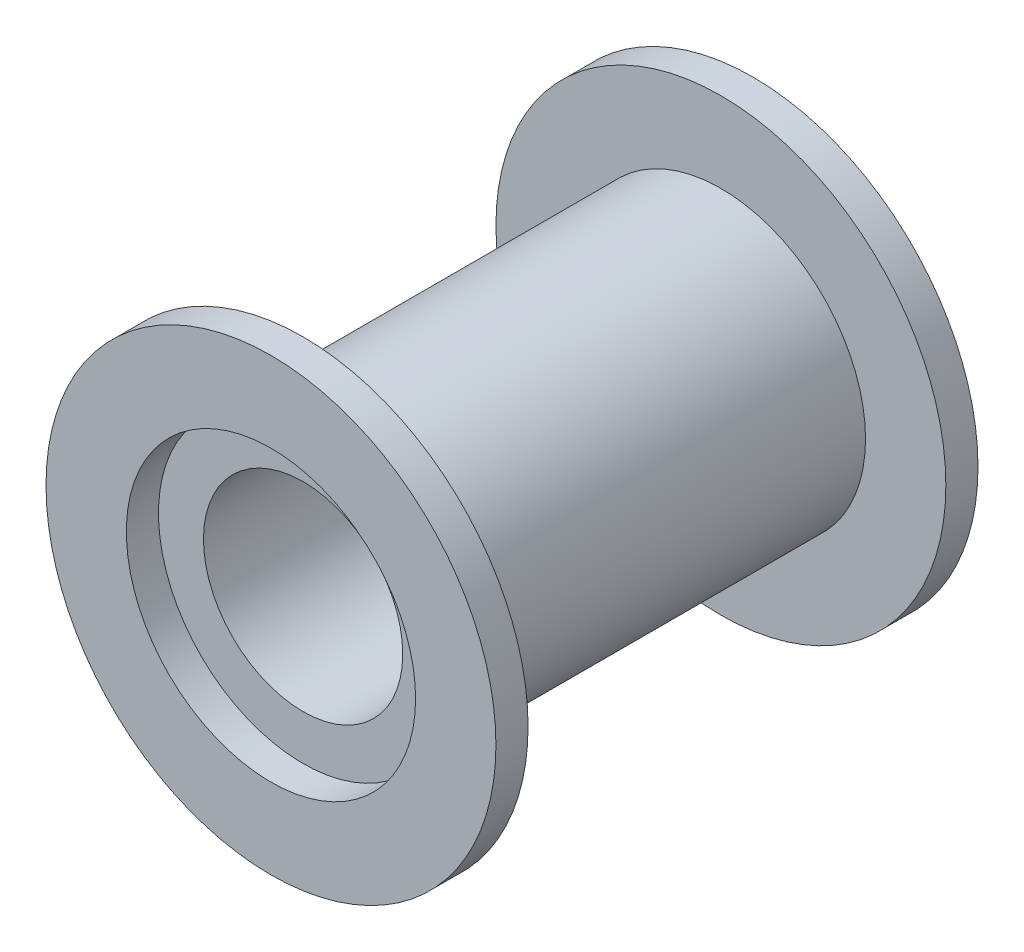
ISO-10303-21;
HEADER;
FILE_DESCRIPTION(('STEP AP214'),'2;1');
FILE_NAME('part.step','',(''),(''),'','','');
FILE_SCHEMA(('AUTOMOTIVE_DESIGN { 1 0 10303 214 1 1 1 1 }'));
ENDSEC;
DATA;
#1=APPLICATION_CONTEXT('core data for automotive mechanical design processes');
#2=APPLICATION_PROTOCOL_DEFINITION('international standard','automotive_design',2000,#1);
#3=PRODUCT_CONTEXT('',#1,'mechanical');
#4=PRODUCT('Part','Part','',(#3));
#5=PRODUCT_RELATED_PRODUCT_CATEGORY('part','',(#4));
#6=PRODUCT_DEFINITION_FORMATION('','',#4);
#7=PRODUCT_DEFINITION_CONTEXT('part definition',#1,'design');
#8=PRODUCT_DEFINITION('design','',#6,#7);
#9=PRODUCT_DEFINITION_SHAPE('','',#8);
#10=(LENGTH_UNIT() NAMED_UNIT(*) SI_UNIT(.MILLI.,.METRE.));
#11=(NAMED_UNIT(*) PLANE_ANGLE_UNIT() SI_UNIT($,.RADIAN.));
#12=(NAMED_UNIT(*) SI_UNIT($,.STERADIAN.) SOLID_ANGLE_UNIT());
#13=UNCERTAINTY_MEASURE_WITH_UNIT(LENGTH_MEASURE(1.E-05),#10,'distance_accuracy_value','');
#14=(GEOMETRIC_REPRESENTATION_CONTEXT(3) GLOBAL_UNCERTAINTY_ASSIGNED_CONTEXT((#13)) GLOBAL_UNIT_ASSIGNED_CONTEXT((#10,
#11,#12)) REPRESENTATION_CONTEXT('',''));
#15=CARTESIAN_POINT('',(0.,0.,0.));
#16=DIRECTION('',(0.,0.,1.));
#17=DIRECTION('',(1.,0.,0.));
#18=AXIS2_PLACEMENT_3D('',#15,#16,#17);
#19=CARTESIAN_POINT('',(0.,0.,15.));
#20=DIRECTION('',(0.,0.,1.));
#21=DIRECTION('',(1.,0.,0.));
#22=AXIS2_PLACEMENT_3D('',#19,#20,#21);
#23=PLANE('',#22);
#24=CARTESIAN_POINT('',(0.,0.,15.));
#25=DIRECTION('',(0.,0.,1.));
#26=DIRECTION('',(1.,0.,0.));
#27=AXIS2_PLACEMENT_3D('',#24,#25,#26);
#28=CIRCLE('',#27,7.);
#29=CARTESIAN_POINT('',(7.,0.,15.));
#30=VERTEX_POINT('',#29);
#31=EDGE_CURVE('E11',#30,#30,#28,.T.);
#32=ORIENTED_EDGE('',*,*,#31,.T.);
#33=EDGE_LOOP('',(#32));
#34=FACE_BOUND('',#33,.T.);
#35=CARTESIAN_POINT('',(0.,0.,15.));
#36=DIRECTION('',(0.,0.,1.));
#37=DIRECTION('',(1.,0.,0.));
#38=AXIS2_PLACEMENT_3D('',#35,#36,#37);
#39=CIRCLE('',#38,4.5);
#40=CARTESIAN_POINT('',(4.5,0.,15.));
#41=VERTEX_POINT('',#40);
#42=EDGE_CURVE('E54',#41,#41,#39,.T.);
#43=ORIENTED_EDGE('',*,*,#42,.F.);
#44=EDGE_LOOP('',(#43));
#45=FACE_BOUND('',#44,.T.);
#46=ADVANCED_FACE('F43',(#34,#45),#23,.T.);
#47=CARTESIAN_POINT('',(0.,0.,14.));
#48=DIRECTION('',(0.,0.,1.));
#49=DIRECTION('',(1.,0.,0.));
#50=AXIS2_PLACEMENT_3D('',#47,#48,#49);
#51=PLANE('',#50);
#52=CARTESIAN_POINT('',(0.,0.,14.));
#53=DIRECTION('',(0.,0.,1.));
#54=DIRECTION('',(1.,0.,0.));
#55=AXIS2_PLACEMENT_3D('',#52,#53,#54);
#56=CIRCLE('',#55,7.);
#57=CARTESIAN_POINT('',(7.,0.,14.));
#58=VERTEX_POINT('',#57);
#59=EDGE_CURVE('E47',#58,#58,#56,.T.);
#60=ORIENTED_EDGE('',*,*,#59,.F.);
#61=EDGE_LOOP('',(#60));
#62=FACE_BOUND('',#61,.T.);
#63=CARTESIAN_POINT('',(0.,0.,14.));
#64=DIRECTION('',(0.,0.,1.));
#65=DIRECTION('',(1.,0.,0.));
#66=AXIS2_PLACEMENT_3D('',#63,#64,#65);
#67=CIRCLE('',#66,4.5);
#68=CARTESIAN_POINT('',(4.5,0.,14.));
#69=VERTEX_POINT('',#68);
#70=EDGE_CURVE('E56',#69,#69,#67,.T.);
#71=ORIENTED_EDGE('',*,*,#70,.T.);
#72=EDGE_LOOP('',(#71));
#73=FACE_BOUND('',#72,.T.);
#74=ADVANCED_FACE('F66',(#62,#73),#51,.F.);
#75=CARTESIAN_POINT('',(0.,0.,15.));
#76=DIRECTION('',(0.,0.,-1.));
#77=DIRECTION('',(-1.,0.,0.));
#78=AXIS2_PLACEMENT_3D('',#75,#76,#77);
#79=CYLINDRICAL_SURFACE('',#78,7.);
#80=ORIENTED_EDGE('',*,*,#31,.F.);
#81=EDGE_LOOP('',(#80));
#82=FACE_BOUND('',#81,.T.);
#83=ORIENTED_EDGE('',*,*,#59,.T.);
#84=EDGE_LOOP('',(#83));
#85=FACE_BOUND('',#84,.T.);
#86=ADVANCED_FACE('F45',(#82,#85),#79,.T.);
#87=CARTESIAN_POINT('',(0.,0.,15.));
#88=DIRECTION('',(0.,0.,-1.));
#89=DIRECTION('',(-1.,0.,0.));
#90=AXIS2_PLACEMENT_3D('',#87,#88,#89);
#91=CYLINDRICAL_SURFACE('',#90,4.5);
#92=ORIENTED_EDGE('',*,*,#42,.T.);
#93=EDGE_LOOP('',(#92));
#94=FACE_BOUND('',#93,.T.);
#95=ORIENTED_EDGE('',*,*,#70,.F.);
#96=EDGE_LOOP('',(#95));
#97=FACE_BOUND('',#96,.T.);
#98=ADVANCED_FACE('F62',(#94,#97),#91,.F.);
#99=CLOSED_SHELL('',(#46,#74,#86,#98));
#100=MANIFOLD_SOLID_BREP('B2',#99);
#101=CARTESIAN_POINT('',(0.,0.,14.));
#102=DIRECTION('',(0.,0.,-1.));
#103=DIRECTION('',(-1.,0.,0.));
#104=AXIS2_PLACEMENT_3D('',#101,#102,#103);
#105=CYLINDRICAL_SURFACE('',#104,3.1);
#106=CARTESIAN_POINT('',(0.,0.,14.));
#107=DIRECTION('',(0.,0.,1.));
#108=DIRECTION('',(1.,0.,0.));
#109=AXIS2_PLACEMENT_3D('',#106,#107,#108);
#110=CIRCLE('',#109,3.1);
#111=CARTESIAN_POINT('',(3.1,0.,14.));
#112=VERTEX_POINT('',#111);
#113=EDGE_CURVE('E112',#112,#112,#110,.T.);
#114=ORIENTED_EDGE('',*,*,#113,.T.);
#115=EDGE_LOOP('',(#114));
#116=FACE_BOUND('',#115,.T.);
#117=CARTESIAN_POINT('',(0.,0.,0.));
#118=DIRECTION('',(0.,0.,1.));
#119=DIRECTION('',(1.,0.,0.));
#120=AXIS2_PLACEMENT_3D('',#117,#118,#119);
#121=CIRCLE('',#120,3.1);
#122=CARTESIAN_POINT('',(3.1,0.,0.));
#123=VERTEX_POINT('',#122);
#124=EDGE_CURVE('E108',#123,#123,#121,.T.);
#125=ORIENTED_EDGE('',*,*,#124,.F.);
#126=EDGE_LOOP('',(#125));
#127=FACE_BOUND('',#126,.T.);
#128=ADVANCED_FACE('F105',(#116,#127),#105,.F.);
#129=CARTESIAN_POINT('',(0.,0.,14.));
#130=DIRECTION('',(0.,0.,-1.));
#131=DIRECTION('',(-1.,0.,0.));
#132=AXIS2_PLACEMENT_3D('',#129,#130,#131);
#133=CYLINDRICAL_SURFACE('',#132,4.5);
#134=CARTESIAN_POINT('',(0.,0.,1.));
#135=DIRECTION('',(0.,0.,1.));
#136=DIRECTION('',(1.,0.,0.));
#137=AXIS2_PLACEMENT_3D('',#134,#135,#136);
#138=CIRCLE('',#137,4.5);
#139=CARTESIAN_POINT('',(4.5,0.,1.));
#140=VERTEX_POINT('',#139);
#141=EDGE_CURVE('E121',#140,#140,#138,.T.);
#142=ORIENTED_EDGE('',*,*,#141,.T.);
#143=EDGE_LOOP('',(#142));
#144=FACE_BOUND('',#143,.T.);
#145=CARTESIAN_POINT('',(0.,0.,14.));
#146=DIRECTION('',(0.,0.,1.));
#147=DIRECTION('',(1.,0.,0.));
#148=AXIS2_PLACEMENT_3D('',#145,#146,#147);
#149=CIRCLE('',#148,4.5);
#150=CARTESIAN_POINT('',(4.5,0.,14.));
#151=VERTEX_POINT('',#150);
#152=EDGE_CURVE('E42',#151,#151,#149,.T.);
#153=ORIENTED_EDGE('',*,*,#152,.F.);
#154=EDGE_LOOP('',(#153));
#155=FACE_BOUND('',#154,.T.);
#156=ADVANCED_FACE('F128',(#144,#155),#133,.T.);
#157=CARTESIAN_POINT('',(0.,0.,14.));
#158=DIRECTION('',(0.,0.,1.));
#159=DIRECTION('',(1.,0.,0.));
#160=AXIS2_PLACEMENT_3D('',#157,#158,#159);
#161=PLANE('',#160);
#162=ORIENTED_EDGE('',*,*,#113,.F.);
#163=EDGE_LOOP('',(#162));
#164=FACE_BOUND('',#163,.T.);
#165=ORIENTED_EDGE('',*,*,#152,.T.);
#166=EDGE_LOOP('',(#165));
#167=FACE_BOUND('',#166,.T.);
#168=ADVANCED_FACE('F145',(#164,#167),#161,.T.);
#169=CARTESIAN_POINT('',(0.,0.,0.));
#170=DIRECTION('',(0.,0.,1.));
#171=DIRECTION('',(1.,0.,0.));
#172=AXIS2_PLACEMENT_3D('',#169,#170,#171);
#173=PLANE('',#172);
#174=ORIENTED_EDGE('',*,*,#124,.T.);
#175=EDGE_LOOP('',(#174));
#176=FACE_BOUND('',#175,.T.);
#177=CARTESIAN_POINT('',(0.,0.,0.));
#178=DIRECTION('',(0.,0.,1.));
#179=DIRECTION('',(1.,0.,0.));
#180=AXIS2_PLACEMENT_3D('',#177,#178,#179);
#181=CIRCLE('',#180,7.);
#182=CARTESIAN_POINT('',(7.,0.,0.));
#183=VERTEX_POINT('',#182);
#184=EDGE_CURVE('E118',#183,#183,#181,.T.);
#185=ORIENTED_EDGE('',*,*,#184,.F.);
#186=EDGE_LOOP('',(#185));
#187=FACE_BOUND('',#186,.T.);
#188=ADVANCED_FACE('F140',(#176,#187),#173,.F.);
#189=CARTESIAN_POINT('',(0.,0.,1.));
#190=DIRECTION('',(0.,0.,-1.));
#191=DIRECTION('',(-1.,0.,0.));
#192=AXIS2_PLACEMENT_3D('',#189,#190,#191);
#193=CYLINDRICAL_SURFACE('',#192,7.);
#194=CARTESIAN_POINT('',(0.,0.,1.));
#195=DIRECTION('',(0.,0.,1.));
#196=DIRECTION('',(1.,0.,0.));
#197=AXIS2_PLACEMENT_3D('',#194,#195,#196);
#198=CIRCLE('',#197,7.);
#199=CARTESIAN_POINT('',(7.,0.,1.));
#200=VERTEX_POINT('',#199);
#201=EDGE_CURVE('E122',#200,#200,#198,.T.);
#202=ORIENTED_EDGE('',*,*,#201,.F.);
#203=EDGE_LOOP('',(#202));
#204=FACE_BOUND('',#203,.T.);
#205=ORIENTED_EDGE('',*,*,#184,.T.);
#206=EDGE_LOOP('',(#205));
#207=FACE_BOUND('',#206,.T.);
#208=ADVANCED_FACE('F134',(#204,#207),#193,.T.);
#209=CARTESIAN_POINT('',(0.,0.,1.));
#210=DIRECTION('',(0.,0.,1.));
#211=DIRECTION('',(1.,0.,0.));
#212=AXIS2_PLACEMENT_3D('',#209,#210,#211);
#213=PLANE('',#212);
#214=ORIENTED_EDGE('',*,*,#141,.F.);
#215=EDGE_LOOP('',(#214));
#216=FACE_BOUND('',#215,.T.);
#217=ORIENTED_EDGE('',*,*,#201,.T.);
#218=EDGE_LOOP('',(#217));
#219=FACE_BOUND('',#218,.T.);
#220=ADVANCED_FACE('F131',(#216,#219),#213,.T.);
#221=CLOSED_SHELL('',(#128,#156,#168,#188,#208,#220));
#222=MANIFOLD_SOLID_BREP('B6',#221);
#223=ADVANCED_BREP_SHAPE_REPRESENTATION('',(#18,#100,#222),#14);
#224=SHAPE_DEFINITION_REPRESENTATION(#9,#223);
ENDSEC;
END-ISO-10303-21;
